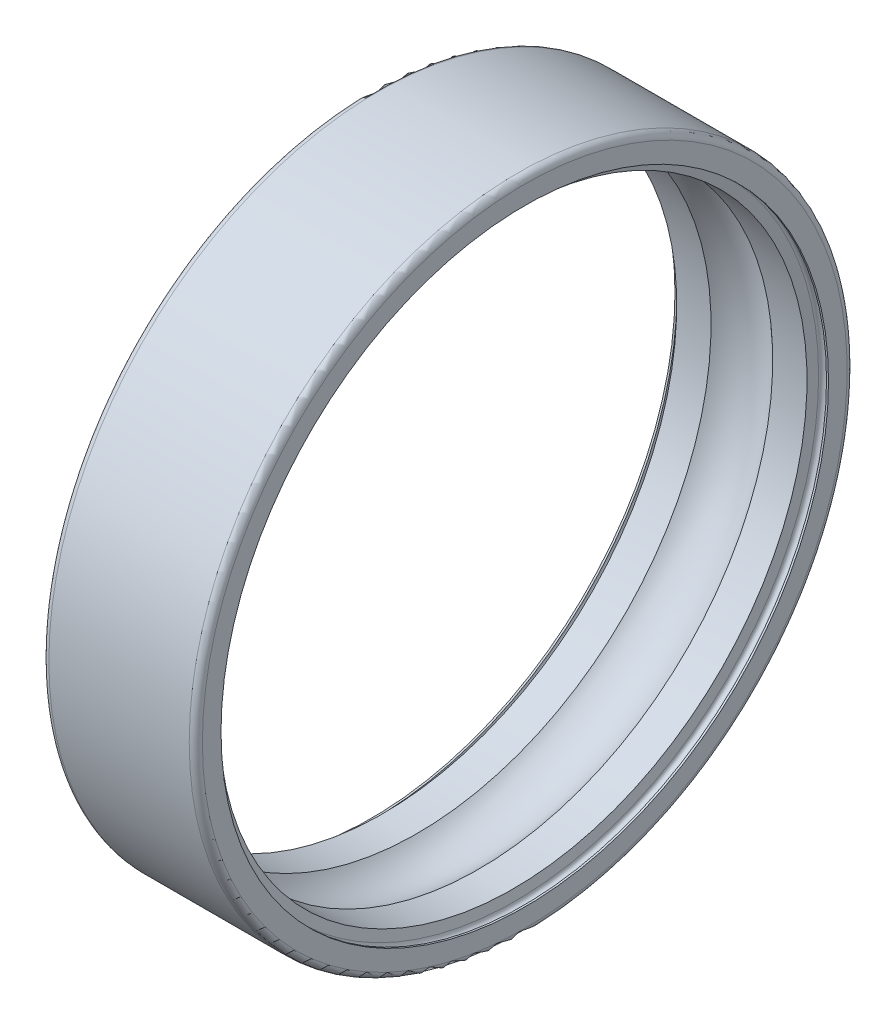
ISO-10303-21;
HEADER;
FILE_DESCRIPTION(('STEP AP214'),'2;1');
FILE_NAME('part.step','',(''),(''),'','','');
FILE_SCHEMA(('AUTOMOTIVE_DESIGN { 1 0 10303 214 1 1 1 1 }'));
ENDSEC;
DATA;
#1=APPLICATION_CONTEXT('core data for automotive mechanical design processes');
#2=APPLICATION_PROTOCOL_DEFINITION('international standard','automotive_design',2000,#1);
#3=PRODUCT_CONTEXT('',#1,'mechanical');
#4=PRODUCT('Part','Part','',(#3));
#5=PRODUCT_RELATED_PRODUCT_CATEGORY('part','',(#4));
#6=PRODUCT_DEFINITION_FORMATION('','',#4);
#7=PRODUCT_DEFINITION_CONTEXT('part definition',#1,'design');
#8=PRODUCT_DEFINITION('design','',#6,#7);
#9=PRODUCT_DEFINITION_SHAPE('','',#8);
#10=(LENGTH_UNIT() NAMED_UNIT(*) SI_UNIT(.MILLI.,.METRE.));
#11=(NAMED_UNIT(*) PLANE_ANGLE_UNIT() SI_UNIT($,.RADIAN.));
#12=(NAMED_UNIT(*) SI_UNIT($,.STERADIAN.) SOLID_ANGLE_UNIT());
#13=UNCERTAINTY_MEASURE_WITH_UNIT(LENGTH_MEASURE(1.E-05),#10,'distance_accuracy_value','');
#14=(GEOMETRIC_REPRESENTATION_CONTEXT(3) GLOBAL_UNCERTAINTY_ASSIGNED_CONTEXT((#13)) GLOBAL_UNIT_ASSIGNED_CONTEXT((#10,
#11,#12)) REPRESENTATION_CONTEXT('',''));
#15=CARTESIAN_POINT('',(0.,0.,0.));
#16=DIRECTION('',(0.,0.,1.));
#17=DIRECTION('',(1.,0.,0.));
#18=AXIS2_PLACEMENT_3D('',#15,#16,#17);
#19=CARTESIAN_POINT('',(0.,-14.9730722443665,-14.7));
#20=DIRECTION('',(-1.,0.,0.));
#21=DIRECTION('',(0.,0.,1.));
#22=AXIS2_PLACEMENT_3D('',#19,#20,#21);
#23=PLANE('',#22);
#24=CARTESIAN_POINT('',(0.,0.,0.));
#25=DIRECTION('',(-1.,0.,0.));
#26=DIRECTION('',(0.,0.,-1.));
#27=AXIS2_PLACEMENT_3D('',#24,#25,#26);
#28=CIRCLE('',#27,14.7);
#29=CARTESIAN_POINT('',(0.,0.,-14.7));
#30=VERTEX_POINT('',#29);
#31=EDGE_CURVE('E64',#30,#30,#28,.F.);
#32=ORIENTED_EDGE('',*,*,#31,.F.);
#33=EDGE_LOOP('',(#32));
#34=FACE_BOUND('',#33,.T.);
#35=CARTESIAN_POINT('',(0.,0.,0.));
#36=DIRECTION('',(1.,0.,0.));
#37=DIRECTION('',(0.,0.,1.));
#38=AXIS2_PLACEMENT_3D('',#35,#36,#37);
#39=CIRCLE('',#38,13.85);
#40=CARTESIAN_POINT('',(0.,0.,13.85));
#41=VERTEX_POINT('',#40);
#42=EDGE_CURVE('E61',#41,#41,#39,.T.);
#43=ORIENTED_EDGE('',*,*,#42,.T.);
#44=EDGE_LOOP('',(#43));
#45=FACE_BOUND('',#44,.T.);
#46=ADVANCED_FACE('F17',(#34,#45),#23,.T.);
#47=CARTESIAN_POINT('',(7.,-14.9730722274429,14.7));
#48=DIRECTION('',(1.,0.,0.));
#49=DIRECTION('',(0.,0.,-1.));
#50=AXIS2_PLACEMENT_3D('',#47,#48,#49);
#51=PLANE('',#50);
#52=CARTESIAN_POINT('',(7.,0.,0.));
#53=DIRECTION('',(1.,0.,0.));
#54=DIRECTION('',(0.,-1.16855737482505E-09,1.));
#55=AXIS2_PLACEMENT_3D('',#52,#53,#54);
#56=CIRCLE('',#55,14.7000000587984);
#57=CARTESIAN_POINT('',(7.,-1.71777934786375E-08,14.7000000587984));
#58=VERTEX_POINT('',#57);
#59=EDGE_CURVE('E58',#58,#58,#56,.T.);
#60=ORIENTED_EDGE('',*,*,#59,.T.);
#61=EDGE_LOOP('',(#60));
#62=FACE_BOUND('',#61,.T.);
#63=CARTESIAN_POINT('',(7.,0.,0.));
#64=DIRECTION('',(-1.,0.,0.));
#65=DIRECTION('',(0.,0.,-1.));
#66=AXIS2_PLACEMENT_3D('',#63,#64,#65);
#67=CIRCLE('',#66,13.85);
#68=CARTESIAN_POINT('',(7.,0.,-13.85));
#69=VERTEX_POINT('',#68);
#70=EDGE_CURVE('E55',#69,#69,#67,.F.);
#71=ORIENTED_EDGE('',*,*,#70,.F.);
#72=EDGE_LOOP('',(#71));
#73=FACE_BOUND('',#72,.T.);
#74=ADVANCED_FACE('F73',(#62,#73),#51,.T.);
#75=CARTESIAN_POINT('',(0.299999999999936,0.,0.));
#76=DIRECTION('',(1.,0.,0.));
#77=DIRECTION('',(0.,1.16855826160653E-09,1.));
#78=AXIS2_PLACEMENT_3D('',#75,#76,#77);
#79=TOROIDAL_SURFACE('',#78,14.7,0.299999999999936);
#80=ORIENTED_EDGE('',*,*,#31,.T.);
#81=EDGE_LOOP('',(#80));
#82=FACE_BOUND('',#81,.T.);
#83=CARTESIAN_POINT('',(0.299999999999936,0.,0.));
#84=DIRECTION('',(-1.,0.,0.));
#85=DIRECTION('',(0.,0.,-1.));
#86=AXIS2_PLACEMENT_3D('',#83,#84,#85);
#87=CIRCLE('',#86,14.9999999999999);
#88=CARTESIAN_POINT('',(0.299999999999936,0.,-14.9999999999999));
#89=VERTEX_POINT('',#88);
#90=EDGE_CURVE('E52',#89,#89,#87,.F.);
#91=ORIENTED_EDGE('',*,*,#90,.F.);
#92=EDGE_LOOP('',(#91));
#93=FACE_BOUND('',#92,.T.);
#94=ADVANCED_FACE('F68',(#82,#93),#79,.T.);
#95=CARTESIAN_POINT('',(50.,0.,0.));
#96=DIRECTION('',(1.,0.,0.));
#97=DIRECTION('',(0.,0.,1.));
#98=AXIS2_PLACEMENT_3D('',#95,#96,#97);
#99=CYLINDRICAL_SURFACE('',#98,13.85);
#100=CARTESIAN_POINT('',(0.0900000000000034,0.,0.));
#101=DIRECTION('',(1.,0.,0.));
#102=DIRECTION('',(0.,0.,1.));
#103=AXIS2_PLACEMENT_3D('',#100,#101,#102);
#104=CIRCLE('',#103,13.85);
#105=CARTESIAN_POINT('',(0.0900000000000034,0.,13.85));
#106=VERTEX_POINT('',#105);
#107=EDGE_CURVE('E49',#106,#106,#104,.T.);
#108=ORIENTED_EDGE('',*,*,#107,.T.);
#109=EDGE_LOOP('',(#108));
#110=FACE_BOUND('',#109,.T.);
#111=ORIENTED_EDGE('',*,*,#42,.F.);
#112=EDGE_LOOP('',(#111));
#113=FACE_BOUND('',#112,.T.);
#114=ADVANCED_FACE('F77',(#110,#113),#99,.F.);
#115=CARTESIAN_POINT('',(0.27,0.,0.));
#116=DIRECTION('',(1.,0.,0.));
#117=DIRECTION('',(0.,0.,1.));
#118=AXIS2_PLACEMENT_3D('',#115,#116,#117);
#119=TOROIDAL_SURFACE('',#118,13.85,0.18);
#120=ORIENTED_EDGE('',*,*,#107,.F.);
#121=EDGE_LOOP('',(#120));
#122=FACE_BOUND('',#121,.T.);
#123=CARTESIAN_POINT('',(0.45,0.,0.));
#124=DIRECTION('',(1.,0.,0.));
#125=DIRECTION('',(0.,0.,1.));
#126=AXIS2_PLACEMENT_3D('',#123,#124,#125);
#127=CIRCLE('',#126,13.85);
#128=CARTESIAN_POINT('',(0.45,0.,13.85));
#129=VERTEX_POINT('',#128);
#130=EDGE_CURVE('E46',#129,#129,#127,.T.);
#131=ORIENTED_EDGE('',*,*,#130,.T.);
#132=EDGE_LOOP('',(#131));
#133=FACE_BOUND('',#132,.T.);
#134=ADVANCED_FACE('F79',(#122,#133),#119,.F.);
#135=CARTESIAN_POINT('',(0.449999999999999,0.,0.));
#136=DIRECTION('',(-1.,0.,0.));
#137=DIRECTION('',(0.,0.,-1.));
#138=AXIS2_PLACEMENT_3D('',#135,#136,#137);
#139=CONICAL_SURFACE('',#138,13.85,1.39626340159546);
#140=ORIENTED_EDGE('',*,*,#130,.F.);
#141=EDGE_LOOP('',(#140));
#142=FACE_BOUND('',#141,.T.);
#143=CARTESIAN_POINT('',(0.529347141318811,0.,0.));
#144=DIRECTION('',(1.,0.,0.));
#145=DIRECTION('',(0.,0.,1.));
#146=AXIS2_PLACEMENT_3D('',#143,#144,#145);
#147=CIRCLE('',#146,13.4);
#148=CARTESIAN_POINT('',(0.529347141318811,0.,13.4));
#149=VERTEX_POINT('',#148);
#150=EDGE_CURVE('E43',#149,#149,#147,.T.);
#151=ORIENTED_EDGE('',*,*,#150,.T.);
#152=EDGE_LOOP('',(#151));
#153=FACE_BOUND('',#152,.T.);
#154=ADVANCED_FACE('F87',(#142,#153),#139,.F.);
#155=CARTESIAN_POINT('',(50.,0.,0.));
#156=DIRECTION('',(1.,0.,0.));
#157=DIRECTION('',(0.,0.,1.));
#158=AXIS2_PLACEMENT_3D('',#155,#156,#157);
#159=CYLINDRICAL_SURFACE('',#158,13.4);
#160=CARTESIAN_POINT('',(2.0935007109849,0.,0.));
#161=DIRECTION('',(1.,0.,0.));
#162=DIRECTION('',(0.,0.,1.));
#163=AXIS2_PLACEMENT_3D('',#160,#161,#162);
#164=CIRCLE('',#163,13.4);
#165=CARTESIAN_POINT('',(2.0935007109849,0.,13.4));
#166=VERTEX_POINT('',#165);
#167=EDGE_CURVE('E40',#166,#166,#164,.T.);
#168=ORIENTED_EDGE('',*,*,#167,.T.);
#169=EDGE_LOOP('',(#168));
#170=FACE_BOUND('',#169,.T.);
#171=ORIENTED_EDGE('',*,*,#150,.F.);
#172=EDGE_LOOP('',(#171));
#173=FACE_BOUND('',#172,.T.);
#174=ADVANCED_FACE('F95',(#170,#173),#159,.F.);
#175=CARTESIAN_POINT('',(3.5,0.,0.));
#176=DIRECTION('',(1.,0.,0.));
#177=DIRECTION('',(0.,0.,1.));
#178=AXIS2_PLACEMENT_3D('',#175,#176,#177);
#179=TOROIDAL_SURFACE('',#178,12.,1.9845);
#180=ORIENTED_EDGE('',*,*,#167,.F.);
#181=EDGE_LOOP('',(#180));
#182=FACE_BOUND('',#181,.T.);
#183=CARTESIAN_POINT('',(4.9064992890151,0.,0.));
#184=DIRECTION('',(1.,0.,0.));
#185=DIRECTION('',(0.,0.,1.));
#186=AXIS2_PLACEMENT_3D('',#183,#184,#185);
#187=CIRCLE('',#186,13.4);
#188=CARTESIAN_POINT('',(4.9064992890151,0.,13.4));
#189=VERTEX_POINT('',#188);
#190=EDGE_CURVE('E37',#189,#189,#187,.T.);
#191=ORIENTED_EDGE('',*,*,#190,.T.);
#192=EDGE_LOOP('',(#191));
#193=FACE_BOUND('',#192,.T.);
#194=ADVANCED_FACE('F99',(#182,#193),#179,.F.);
#195=CARTESIAN_POINT('',(50.,0.,0.));
#196=DIRECTION('',(1.,0.,0.));
#197=DIRECTION('',(0.,0.,1.));
#198=AXIS2_PLACEMENT_3D('',#195,#196,#197);
#199=CYLINDRICAL_SURFACE('',#198,13.4);
#200=CARTESIAN_POINT('',(6.4706528586812,0.,0.));
#201=DIRECTION('',(1.,0.,0.));
#202=DIRECTION('',(0.,0.,1.));
#203=AXIS2_PLACEMENT_3D('',#200,#201,#202);
#204=CIRCLE('',#203,13.4);
#205=CARTESIAN_POINT('',(6.4706528586812,0.,13.4));
#206=VERTEX_POINT('',#205);
#207=EDGE_CURVE('E32',#206,#206,#204,.T.);
#208=ORIENTED_EDGE('',*,*,#207,.T.);
#209=EDGE_LOOP('',(#208));
#210=FACE_BOUND('',#209,.T.);
#211=ORIENTED_EDGE('',*,*,#190,.F.);
#212=EDGE_LOOP('',(#211));
#213=FACE_BOUND('',#212,.T.);
#214=ADVANCED_FACE('F103',(#210,#213),#199,.F.);
#215=CARTESIAN_POINT('',(6.55,0.,0.));
#216=DIRECTION('',(1.,0.,0.));
#217=DIRECTION('',(0.,0.,1.));
#218=AXIS2_PLACEMENT_3D('',#215,#216,#217);
#219=CONICAL_SURFACE('',#218,13.85,1.39626340159549);
#220=CARTESIAN_POINT('',(6.55,0.,0.));
#221=DIRECTION('',(1.,0.,0.));
#222=DIRECTION('',(0.,0.,1.));
#223=AXIS2_PLACEMENT_3D('',#220,#221,#222);
#224=CIRCLE('',#223,13.85);
#225=CARTESIAN_POINT('',(6.55,0.,13.85));
#226=VERTEX_POINT('',#225);
#227=EDGE_CURVE('E28',#226,#226,#224,.T.);
#228=ORIENTED_EDGE('',*,*,#227,.T.);
#229=EDGE_LOOP('',(#228));
#230=FACE_BOUND('',#229,.T.);
#231=ORIENTED_EDGE('',*,*,#207,.F.);
#232=EDGE_LOOP('',(#231));
#233=FACE_BOUND('',#232,.T.);
#234=ADVANCED_FACE('F107',(#230,#233),#219,.F.);
#235=CARTESIAN_POINT('',(6.73,0.,0.));
#236=DIRECTION('',(1.,0.,0.));
#237=DIRECTION('',(0.,0.,1.));
#238=AXIS2_PLACEMENT_3D('',#235,#236,#237);
#239=TOROIDAL_SURFACE('',#238,13.85,0.18);
#240=ORIENTED_EDGE('',*,*,#227,.F.);
#241=EDGE_LOOP('',(#240));
#242=FACE_BOUND('',#241,.T.);
#243=CARTESIAN_POINT('',(6.91,0.,0.));
#244=DIRECTION('',(1.,0.,0.));
#245=DIRECTION('',(0.,0.,1.));
#246=AXIS2_PLACEMENT_3D('',#243,#244,#245);
#247=CIRCLE('',#246,13.85);
#248=CARTESIAN_POINT('',(6.91,0.,13.85));
#249=VERTEX_POINT('',#248);
#250=EDGE_CURVE('E24',#249,#249,#247,.T.);
#251=ORIENTED_EDGE('',*,*,#250,.T.);
#252=EDGE_LOOP('',(#251));
#253=FACE_BOUND('',#252,.T.);
#254=ADVANCED_FACE('F111',(#242,#253),#239,.F.);
#255=CARTESIAN_POINT('',(50.,0.,0.));
#256=DIRECTION('',(1.,0.,0.));
#257=DIRECTION('',(0.,0.,1.));
#258=AXIS2_PLACEMENT_3D('',#255,#256,#257);
#259=CYLINDRICAL_SURFACE('',#258,13.85);
#260=ORIENTED_EDGE('',*,*,#70,.T.);
#261=EDGE_LOOP('',(#260));
#262=FACE_BOUND('',#261,.T.);
#263=ORIENTED_EDGE('',*,*,#250,.F.);
#264=EDGE_LOOP('',(#263));
#265=FACE_BOUND('',#264,.T.);
#266=ADVANCED_FACE('F115',(#262,#265),#259,.F.);
#267=CARTESIAN_POINT('',(6.70000000000013,0.,0.));
#268=DIRECTION('',(1.,0.,0.));
#269=DIRECTION('',(0.,0.,1.));
#270=AXIS2_PLACEMENT_3D('',#267,#268,#269);
#271=TOROIDAL_SURFACE('',#270,14.7000000000001,0.299999999999875);
#272=CARTESIAN_POINT('',(6.70000000000013,0.,0.));
#273=DIRECTION('',(1.,0.,0.));
#274=DIRECTION('',(0.,0.,1.));
#275=AXIS2_PLACEMENT_3D('',#272,#273,#274);
#276=CIRCLE('',#275,15.);
#277=CARTESIAN_POINT('',(6.70000000000013,0.,15.));
#278=VERTEX_POINT('',#277);
#279=EDGE_CURVE('E10',#278,#278,#276,.T.);
#280=ORIENTED_EDGE('',*,*,#279,.T.);
#281=EDGE_LOOP('',(#280));
#282=FACE_BOUND('',#281,.T.);
#283=ORIENTED_EDGE('',*,*,#59,.F.);
#284=EDGE_LOOP('',(#283));
#285=FACE_BOUND('',#284,.T.);
#286=ADVANCED_FACE('F118',(#282,#285),#271,.T.);
#287=CARTESIAN_POINT('',(50.,0.,0.));
#288=DIRECTION('',(1.,0.,0.));
#289=DIRECTION('',(0.,1.92342708767309E-10,1.));
#290=AXIS2_PLACEMENT_3D('',#287,#288,#289);
#291=CYLINDRICAL_SURFACE('',#290,15.);
#292=ORIENTED_EDGE('',*,*,#90,.T.);
#293=EDGE_LOOP('',(#292));
#294=FACE_BOUND('',#293,.T.);
#295=ORIENTED_EDGE('',*,*,#279,.F.);
#296=EDGE_LOOP('',(#295));
#297=FACE_BOUND('',#296,.T.);
#298=ADVANCED_FACE('F19',(#294,#297),#291,.T.);
#299=CLOSED_SHELL('',(#46,#74,#94,#114,#134,#154,#174,#194,#214,#234,#254,#266,#286,#298));
#300=MANIFOLD_SOLID_BREP('B1',#299);
#301=ADVANCED_BREP_SHAPE_REPRESENTATION('',(#18,#300),#14);
#302=SHAPE_DEFINITION_REPRESENTATION(#9,#301);
ENDSEC;
END-ISO-10303-21;
